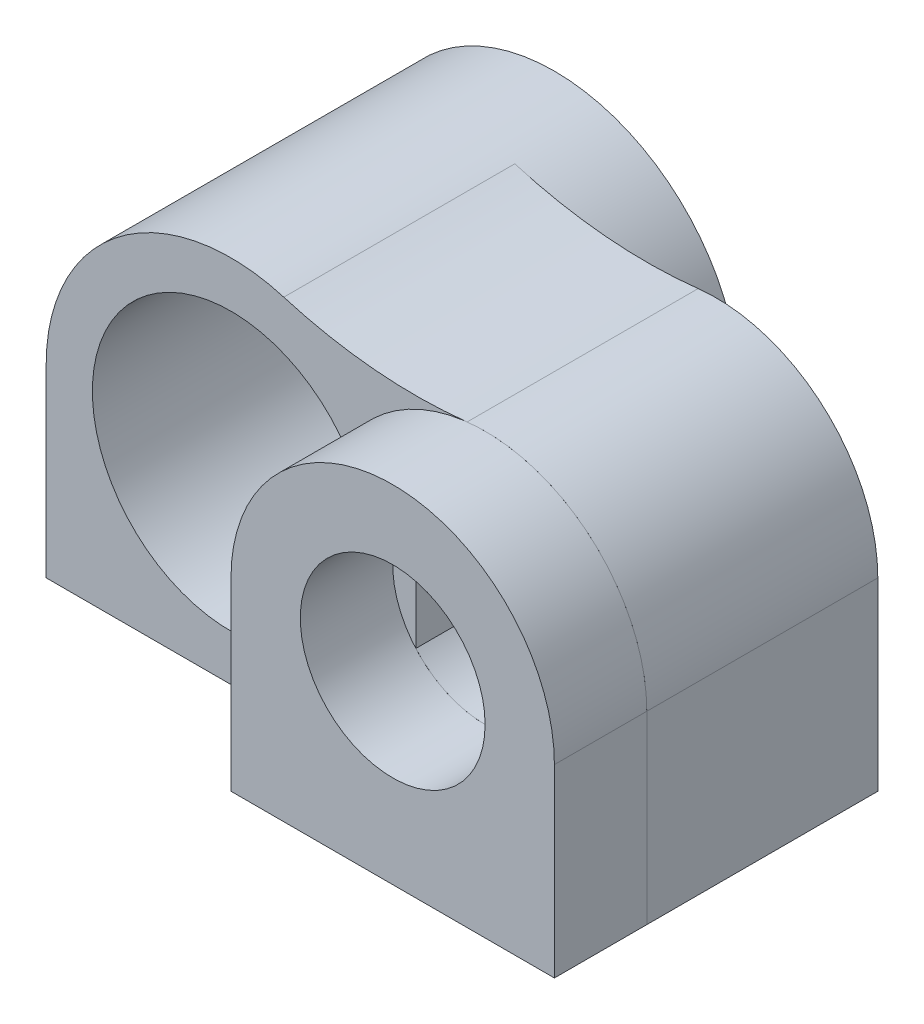
ISO-10303-21;
HEADER;
FILE_DESCRIPTION(('STEP AP214'),'2;1');
FILE_NAME('part.step','',(''),(''),'','','');
FILE_SCHEMA(('AUTOMOTIVE_DESIGN { 1 0 10303 214 1 1 1 1 }'));
ENDSEC;
DATA;
#1=APPLICATION_CONTEXT('core data for automotive mechanical design processes');
#2=APPLICATION_PROTOCOL_DEFINITION('international standard','automotive_design',2000,#1);
#3=PRODUCT_CONTEXT('',#1,'mechanical');
#4=PRODUCT('Part','Part','',(#3));
#5=PRODUCT_RELATED_PRODUCT_CATEGORY('part','',(#4));
#6=PRODUCT_DEFINITION_FORMATION('','',#4);
#7=PRODUCT_DEFINITION_CONTEXT('part definition',#1,'design');
#8=PRODUCT_DEFINITION('design','',#6,#7);
#9=PRODUCT_DEFINITION_SHAPE('','',#8);
#10=(LENGTH_UNIT() NAMED_UNIT(*) SI_UNIT(.MILLI.,.METRE.));
#11=(NAMED_UNIT(*) PLANE_ANGLE_UNIT() SI_UNIT($,.RADIAN.));
#12=(NAMED_UNIT(*) SI_UNIT($,.STERADIAN.) SOLID_ANGLE_UNIT());
#13=UNCERTAINTY_MEASURE_WITH_UNIT(LENGTH_MEASURE(1.E-05),#10,'distance_accuracy_value','');
#14=(GEOMETRIC_REPRESENTATION_CONTEXT(3) GLOBAL_UNCERTAINTY_ASSIGNED_CONTEXT((#13)) GLOBAL_UNIT_ASSIGNED_CONTEXT((#10,
#11,#12)) REPRESENTATION_CONTEXT('',''));
#15=CARTESIAN_POINT('',(0.,0.,0.));
#16=DIRECTION('',(0.,0.,1.));
#17=DIRECTION('',(1.,0.,0.));
#18=AXIS2_PLACEMENT_3D('',#15,#16,#17);
#19=CARTESIAN_POINT('',(5.5,0.,9.));
#20=DIRECTION('',(0.,0.,-1.));
#21=DIRECTION('',(-1.,0.,0.));
#22=AXIS2_PLACEMENT_3D('',#19,#20,#21);
#23=CYLINDRICAL_SURFACE('',#22,3.5);
#24=CARTESIAN_POINT('',(5.5,0.,7.));
#25=DIRECTION('',(0.,0.,1.));
#26=DIRECTION('',(1.,0.,0.));
#27=AXIS2_PLACEMENT_3D('',#24,#25,#26);
#28=CIRCLE('',#27,3.5);
#29=CARTESIAN_POINT('',(9.,0.,7.));
#30=VERTEX_POINT('',#29);
#31=CARTESIAN_POINT('',(2.,0.,7.));
#32=VERTEX_POINT('',#31);
#33=EDGE_CURVE('E116',#30,#32,#28,.T.);
#34=ORIENTED_EDGE('',*,*,#33,.T.);
#35=DIRECTION('',(0.,0.,-1.));
#36=VECTOR('',#35,1.);
#37=CARTESIAN_POINT('',(2.,0.,9.));
#38=LINE('',#37,#36);
#39=CARTESIAN_POINT('',(2.,0.,9.));
#40=VERTEX_POINT('',#39);
#41=EDGE_CURVE('E12',#40,#32,#38,.T.);
#42=ORIENTED_EDGE('',*,*,#41,.F.);
#43=CARTESIAN_POINT('',(5.5,0.,9.));
#44=DIRECTION('',(0.,0.,1.));
#45=DIRECTION('',(1.,0.,0.));
#46=AXIS2_PLACEMENT_3D('',#43,#44,#45);
#47=CIRCLE('',#46,3.5);
#48=CARTESIAN_POINT('',(9.,0.,9.));
#49=VERTEX_POINT('',#48);
#50=EDGE_CURVE('E101',#49,#40,#47,.T.);
#51=ORIENTED_EDGE('',*,*,#50,.F.);
#52=DIRECTION('',(0.,0.,-1.));
#53=VECTOR('',#52,1.);
#54=CARTESIAN_POINT('',(9.,0.,9.));
#55=LINE('',#54,#53);
#56=EDGE_CURVE('E115',#49,#30,#55,.T.);
#57=ORIENTED_EDGE('',*,*,#56,.T.);
#58=EDGE_LOOP('',(#34,#42,#51,#57));
#59=FACE_BOUND('',#58,.T.);
#60=ADVANCED_FACE('F49',(#59),#23,.T.);
#61=CARTESIAN_POINT('',(2.,0.,9.));
#62=DIRECTION('',(1.,0.,0.));
#63=DIRECTION('',(0.,1.,0.));
#64=AXIS2_PLACEMENT_3D('',#61,#62,#63);
#65=PLANE('',#64);
#66=DIRECTION('',(0.,-1.,0.));
#67=VECTOR('',#66,1.);
#68=CARTESIAN_POINT('',(2.,0.,7.));
#69=LINE('',#68,#67);
#70=CARTESIAN_POINT('',(2.,-4.,7.));
#71=VERTEX_POINT('',#70);
#72=EDGE_CURVE('E105',#32,#71,#69,.T.);
#73=ORIENTED_EDGE('',*,*,#72,.T.);
#74=DIRECTION('',(0.,0.,-1.));
#75=VECTOR('',#74,1.);
#76=CARTESIAN_POINT('',(2.,-4.,9.));
#77=LINE('',#76,#75);
#78=CARTESIAN_POINT('',(2.,-4.,9.));
#79=VERTEX_POINT('',#78);
#80=EDGE_CURVE('E57',#79,#71,#77,.T.);
#81=ORIENTED_EDGE('',*,*,#80,.F.);
#82=DIRECTION('',(0.,-1.,0.));
#83=VECTOR('',#82,1.);
#84=CARTESIAN_POINT('',(2.,0.,9.));
#85=LINE('',#84,#83);
#86=EDGE_CURVE('E95',#40,#79,#85,.T.);
#87=ORIENTED_EDGE('',*,*,#86,.F.);
#88=ORIENTED_EDGE('',*,*,#41,.T.);
#89=EDGE_LOOP('',(#73,#81,#87,#88));
#90=FACE_BOUND('',#89,.T.);
#91=ADVANCED_FACE('F104',(#90),#65,.F.);
#92=CARTESIAN_POINT('',(0.,-4.,9.));
#93=DIRECTION('',(0.,1.,0.));
#94=DIRECTION('',(0.,0.,1.));
#95=AXIS2_PLACEMENT_3D('',#92,#93,#94);
#96=PLANE('',#95);
#97=DIRECTION('',(1.,0.,0.));
#98=VECTOR('',#97,1.);
#99=CARTESIAN_POINT('',(0.,-4.,7.));
#100=LINE('',#99,#98);
#101=CARTESIAN_POINT('',(9.,-4.,7.));
#102=VERTEX_POINT('',#101);
#103=EDGE_CURVE('E82',#71,#102,#100,.T.);
#104=ORIENTED_EDGE('',*,*,#103,.T.);
#105=DIRECTION('',(0.,0.,-1.));
#106=VECTOR('',#105,1.);
#107=CARTESIAN_POINT('',(9.,-4.,9.));
#108=LINE('',#107,#106);
#109=CARTESIAN_POINT('',(9.,-4.,9.));
#110=VERTEX_POINT('',#109);
#111=EDGE_CURVE('E106',#110,#102,#108,.T.);
#112=ORIENTED_EDGE('',*,*,#111,.F.);
#113=DIRECTION('',(1.,0.,0.));
#114=VECTOR('',#113,1.);
#115=CARTESIAN_POINT('',(0.,-4.,9.));
#116=LINE('',#115,#114);
#117=EDGE_CURVE('E99',#79,#110,#116,.T.);
#118=ORIENTED_EDGE('',*,*,#117,.F.);
#119=ORIENTED_EDGE('',*,*,#80,.T.);
#120=EDGE_LOOP('',(#104,#112,#118,#119));
#121=FACE_BOUND('',#120,.T.);
#122=ADVANCED_FACE('F107',(#121),#96,.F.);
#123=CARTESIAN_POINT('',(9.,0.,9.));
#124=DIRECTION('',(-1.,0.,0.));
#125=DIRECTION('',(0.,0.,1.));
#126=AXIS2_PLACEMENT_3D('',#123,#124,#125);
#127=PLANE('',#126);
#128=DIRECTION('',(0.,1.,0.));
#129=VECTOR('',#128,1.);
#130=CARTESIAN_POINT('',(9.,0.,7.));
#131=LINE('',#130,#129);
#132=EDGE_CURVE('E88',#102,#30,#131,.T.);
#133=ORIENTED_EDGE('',*,*,#132,.T.);
#134=ORIENTED_EDGE('',*,*,#56,.F.);
#135=DIRECTION('',(0.,1.,0.));
#136=VECTOR('',#135,1.);
#137=CARTESIAN_POINT('',(9.,0.,9.));
#138=LINE('',#137,#136);
#139=EDGE_CURVE('E65',#110,#49,#138,.T.);
#140=ORIENTED_EDGE('',*,*,#139,.F.);
#141=ORIENTED_EDGE('',*,*,#111,.T.);
#142=EDGE_LOOP('',(#133,#134,#140,#141));
#143=FACE_BOUND('',#142,.T.);
#144=ADVANCED_FACE('F126',(#143),#127,.F.);
#145=CARTESIAN_POINT('',(5.5,0.,9.));
#146=DIRECTION('',(0.,0.,-1.));
#147=DIRECTION('',(-1.,0.,0.));
#148=AXIS2_PLACEMENT_3D('',#145,#146,#147);
#149=CYLINDRICAL_SURFACE('',#148,2.);
#150=CARTESIAN_POINT('',(5.5,0.,9.));
#151=DIRECTION('',(0.,0.,1.));
#152=DIRECTION('',(1.,0.,0.));
#153=AXIS2_PLACEMENT_3D('',#150,#151,#152);
#154=CIRCLE('',#153,2.);
#155=CARTESIAN_POINT('',(7.5,0.,9.));
#156=VERTEX_POINT('',#155);
#157=EDGE_CURVE('E109',#156,#156,#154,.T.);
#158=ORIENTED_EDGE('',*,*,#157,.T.);
#159=EDGE_LOOP('',(#158));
#160=FACE_BOUND('',#159,.T.);
#161=CARTESIAN_POINT('',(5.5,0.,7.));
#162=DIRECTION('',(0.,0.,1.));
#163=DIRECTION('',(1.,0.,0.));
#164=AXIS2_PLACEMENT_3D('',#161,#162,#163);
#165=CIRCLE('',#164,2.);
#166=CARTESIAN_POINT('',(7.5,0.,7.));
#167=VERTEX_POINT('',#166);
#168=EDGE_CURVE('E122',#167,#167,#165,.T.);
#169=ORIENTED_EDGE('',*,*,#168,.F.);
#170=EDGE_LOOP('',(#169));
#171=FACE_BOUND('',#170,.T.);
#172=ADVANCED_FACE('F143',(#160,#171),#149,.F.);
#173=CARTESIAN_POINT('',(0.,0.,9.));
#174=DIRECTION('',(0.,0.,1.));
#175=DIRECTION('',(1.,0.,0.));
#176=AXIS2_PLACEMENT_3D('',#173,#174,#175);
#177=PLANE('',#176);
#178=ORIENTED_EDGE('',*,*,#50,.T.);
#179=ORIENTED_EDGE('',*,*,#86,.T.);
#180=ORIENTED_EDGE('',*,*,#117,.T.);
#181=ORIENTED_EDGE('',*,*,#139,.T.);
#182=EDGE_LOOP('',(#178,#179,#180,#181));
#183=FACE_BOUND('',#182,.T.);
#184=ORIENTED_EDGE('',*,*,#157,.F.);
#185=EDGE_LOOP('',(#184));
#186=FACE_BOUND('',#185,.T.);
#187=ADVANCED_FACE('F96',(#183,#186),#177,.T.);
#188=CARTESIAN_POINT('',(0.,0.,7.));
#189=DIRECTION('',(0.,0.,1.));
#190=DIRECTION('',(1.,0.,0.));
#191=AXIS2_PLACEMENT_3D('',#188,#189,#190);
#192=PLANE('',#191);
#193=ORIENTED_EDGE('',*,*,#33,.F.);
#194=ORIENTED_EDGE('',*,*,#132,.F.);
#195=ORIENTED_EDGE('',*,*,#103,.F.);
#196=ORIENTED_EDGE('',*,*,#72,.F.);
#197=EDGE_LOOP('',(#193,#194,#195,#196));
#198=FACE_BOUND('',#197,.T.);
#199=ORIENTED_EDGE('',*,*,#168,.T.);
#200=EDGE_LOOP('',(#199));
#201=FACE_BOUND('',#200,.T.);
#202=ADVANCED_FACE('F129',(#198,#201),#192,.F.);
#203=CLOSED_SHELL('',(#60,#91,#122,#144,#172,#187,#202));
#204=MANIFOLD_SOLID_BREP('B2',#203);
#205=CARTESIAN_POINT('',(0.,0.,7.));
#206=DIRECTION('',(0.,0.,-1.));
#207=DIRECTION('',(-1.,0.,0.));
#208=AXIS2_PLACEMENT_3D('',#205,#206,#207);
#209=CYLINDRICAL_SURFACE('',#208,4.);
#210=CARTESIAN_POINT('',(0.,0.,7.));
#211=DIRECTION('',(0.,0.,1.));
#212=DIRECTION('',(1.,0.,0.));
#213=AXIS2_PLACEMENT_3D('',#210,#211,#212);
#214=CIRCLE('',#213,4.);
#215=CARTESIAN_POINT('',(1.14285714285714,3.83325938999964,7.));
#216=VERTEX_POINT('',#215);
#217=CARTESIAN_POINT('',(-4.,0.,7.));
#218=VERTEX_POINT('',#217);
#219=EDGE_CURVE('E343',#216,#218,#214,.T.);
#220=ORIENTED_EDGE('',*,*,#219,.F.);
#221=DIRECTION('',(0.,0.,-1.));
#222=VECTOR('',#221,1.);
#223=CARTESIAN_POINT('',(1.14285714285714,3.83325938999964,7.));
#224=LINE('',#223,#222);
#225=CARTESIAN_POINT('',(1.14285714285714,3.83325938999964,2.));
#226=VERTEX_POINT('',#225);
#227=EDGE_CURVE('E371',#216,#226,#224,.T.);
#228=ORIENTED_EDGE('',*,*,#227,.T.);
#229=CARTESIAN_POINT('',(0.,0.,2.));
#230=DIRECTION('',(0.,0.,1.));
#231=DIRECTION('',(1.,0.,0.));
#232=AXIS2_PLACEMENT_3D('',#229,#230,#231);
#233=CIRCLE('',#232,4.);
#234=CARTESIAN_POINT('',(3.84090909090909,1.11687839775506,2.));
#235=VERTEX_POINT('',#234);
#236=EDGE_CURVE('E229',#235,#226,#233,.T.);
#237=ORIENTED_EDGE('',*,*,#236,.F.);
#238=DIRECTION('',(0.,0.,1.));
#239=VECTOR('',#238,1.);
#240=CARTESIAN_POINT('',(3.84090909090909,1.11687839775506,2.));
#241=LINE('',#240,#239);
#242=CARTESIAN_POINT('',(3.84090909090909,1.11687839775506,7.));
#243=VERTEX_POINT('',#242);
#244=EDGE_CURVE('E301',#235,#243,#241,.T.);
#245=ORIENTED_EDGE('',*,*,#244,.T.);
#246=CARTESIAN_POINT('',(4.,0.,7.));
#247=VERTEX_POINT('',#246);
#248=EDGE_CURVE('E339',#247,#243,#214,.T.);
#249=ORIENTED_EDGE('',*,*,#248,.F.);
#250=DIRECTION('',(0.,0.,-1.));
#251=VECTOR('',#250,1.);
#252=CARTESIAN_POINT('',(4.,0.,7.));
#253=LINE('',#252,#251);
#254=CARTESIAN_POINT('',(4.,0.,0.));
#255=VERTEX_POINT('',#254);
#256=EDGE_CURVE('E349',#247,#255,#253,.T.);
#257=ORIENTED_EDGE('',*,*,#256,.T.);
#258=CARTESIAN_POINT('',(0.,0.,0.));
#259=DIRECTION('',(0.,0.,1.));
#260=DIRECTION('',(1.,0.,0.));
#261=AXIS2_PLACEMENT_3D('',#258,#259,#260);
#262=CIRCLE('',#261,4.);
#263=CARTESIAN_POINT('',(-4.,0.,0.));
#264=VERTEX_POINT('',#263);
#265=EDGE_CURVE('E336',#255,#264,#262,.T.);
#266=ORIENTED_EDGE('',*,*,#265,.T.);
#267=DIRECTION('',(0.,0.,-1.));
#268=VECTOR('',#267,1.);
#269=CARTESIAN_POINT('',(-4.,0.,7.));
#270=LINE('',#269,#268);
#271=EDGE_CURVE('E366',#218,#264,#270,.T.);
#272=ORIENTED_EDGE('',*,*,#271,.F.);
#273=EDGE_LOOP('',(#220,#228,#237,#245,#249,#257,#266,#272));
#274=FACE_BOUND('',#273,.T.);
#275=ADVANCED_FACE('F215',(#274),#209,.T.);
#276=CARTESIAN_POINT('',(4.,-4.,7.));
#277=DIRECTION('',(-1.,0.,0.));
#278=DIRECTION('',(0.,-1.,0.));
#279=AXIS2_PLACEMENT_3D('',#276,#277,#278);
#280=PLANE('',#279);
#281=DIRECTION('',(0.,0.,1.));
#282=VECTOR('',#281,1.);
#283=CARTESIAN_POINT('',(4.,-1.3228756555323,2.));
#284=LINE('',#283,#282);
#285=CARTESIAN_POINT('',(4.,-1.3228756555323,2.));
#286=VERTEX_POINT('',#285);
#287=CARTESIAN_POINT('',(4.,-1.3228756555323,7.));
#288=VERTEX_POINT('',#287);
#289=EDGE_CURVE('E328',#286,#288,#284,.T.);
#290=ORIENTED_EDGE('',*,*,#289,.F.);
#291=DIRECTION('',(0.,1.,0.));
#292=VECTOR('',#291,1.);
#293=CARTESIAN_POINT('',(4.,0.,2.));
#294=LINE('',#293,#292);
#295=CARTESIAN_POINT('',(4.,-4.,2.));
#296=VERTEX_POINT('',#295);
#297=EDGE_CURVE('E320',#296,#286,#294,.T.);
#298=ORIENTED_EDGE('',*,*,#297,.F.);
#299=DIRECTION('',(0.,0.,-1.));
#300=VECTOR('',#299,1.);
#301=CARTESIAN_POINT('',(4.,-4.,7.));
#302=LINE('',#301,#300);
#303=CARTESIAN_POINT('',(4.,-4.,0.));
#304=VERTEX_POINT('',#303);
#305=EDGE_CURVE('E361',#296,#304,#302,.T.);
#306=ORIENTED_EDGE('',*,*,#305,.T.);
#307=DIRECTION('',(0.,1.,0.));
#308=VECTOR('',#307,1.);
#309=CARTESIAN_POINT('',(4.,-4.,0.));
#310=LINE('',#309,#308);
#311=EDGE_CURVE('E357',#304,#255,#310,.T.);
#312=ORIENTED_EDGE('',*,*,#311,.T.);
#313=ORIENTED_EDGE('',*,*,#256,.F.);
#314=DIRECTION('',(0.,1.,0.));
#315=VECTOR('',#314,1.);
#316=CARTESIAN_POINT('',(4.,-4.,7.));
#317=LINE('',#316,#315);
#318=EDGE_CURVE('E347',#288,#247,#317,.T.);
#319=ORIENTED_EDGE('',*,*,#318,.F.);
#320=EDGE_LOOP('',(#290,#298,#306,#312,#313,#319));
#321=FACE_BOUND('',#320,.T.);
#322=ADVANCED_FACE('F388',(#321),#280,.F.);
#323=CARTESIAN_POINT('',(0.,0.,7.));
#324=DIRECTION('',(0.,0.,1.));
#325=DIRECTION('',(1.,0.,0.));
#326=AXIS2_PLACEMENT_3D('',#323,#324,#325);
#327=PLANE('',#326);
#328=CARTESIAN_POINT('',(5.5,0.,7.));
#329=DIRECTION('',(0.,0.,1.));
#330=DIRECTION('',(1.,0.,0.));
#331=AXIS2_PLACEMENT_3D('',#328,#329,#330);
#332=CIRCLE('',#331,3.5);
#333=CARTESIAN_POINT('',(9.,0.,7.));
#334=VERTEX_POINT('',#333);
#335=CARTESIAN_POINT('',(5.11111111111111,3.47832796499967,7.));
#336=VERTEX_POINT('',#335);
#337=EDGE_CURVE('E296',#334,#336,#332,.T.);
#338=ORIENTED_EDGE('',*,*,#337,.T.);
#339=CARTESIAN_POINT('',(4.,13.4164078649987,7.));
#340=DIRECTION('',(0.,0.,1.));
#341=DIRECTION('',(1.,0.,0.));
#342=AXIS2_PLACEMENT_3D('',#339,#340,#341);
#343=CIRCLE('',#342,10.);
#344=EDGE_CURVE('E223',#336,#216,#343,.F.);
#345=ORIENTED_EDGE('',*,*,#344,.T.);
#346=ORIENTED_EDGE('',*,*,#219,.T.);
#347=DIRECTION('',(0.,-1.,0.));
#348=VECTOR('',#347,1.);
#349=CARTESIAN_POINT('',(-4.,0.,7.));
#350=LINE('',#349,#348);
#351=CARTESIAN_POINT('',(-4.,-4.,7.));
#352=VERTEX_POINT('',#351);
#353=EDGE_CURVE('E342',#218,#352,#350,.T.);
#354=ORIENTED_EDGE('',*,*,#353,.T.);
#355=DIRECTION('',(1.,0.,0.));
#356=VECTOR('',#355,1.);
#357=CARTESIAN_POINT('',(-4.,-4.,7.));
#358=LINE('',#357,#356);
#359=CARTESIAN_POINT('',(9.,-4.,7.));
#360=VERTEX_POINT('',#359);
#361=EDGE_CURVE('E345',#352,#360,#358,.T.);
#362=ORIENTED_EDGE('',*,*,#361,.T.);
#363=DIRECTION('',(0.,1.,0.));
#364=VECTOR('',#363,1.);
#365=CARTESIAN_POINT('',(9.,0.,7.));
#366=LINE('',#365,#364);
#367=EDGE_CURVE('E323',#360,#334,#366,.T.);
#368=ORIENTED_EDGE('',*,*,#367,.T.);
#369=EDGE_LOOP('',(#338,#345,#346,#354,#362,#368));
#370=FACE_BOUND('',#369,.T.);
#371=ORIENTED_EDGE('',*,*,#248,.T.);
#372=CARTESIAN_POINT('',(5.5,0.,7.));
#373=DIRECTION('',(0.,0.,1.));
#374=DIRECTION('',(1.,0.,0.));
#375=AXIS2_PLACEMENT_3D('',#372,#373,#374);
#376=CIRCLE('',#375,2.);
#377=EDGE_CURVE('E313',#288,#243,#376,.T.);
#378=ORIENTED_EDGE('',*,*,#377,.F.);
#379=ORIENTED_EDGE('',*,*,#318,.T.);
#380=EDGE_LOOP('',(#371,#378,#379));
#381=FACE_BOUND('',#380,.T.);
#382=CARTESIAN_POINT('',(0.,0.,7.));
#383=DIRECTION('',(0.,0.,1.));
#384=DIRECTION('',(1.,0.,0.));
#385=AXIS2_PLACEMENT_3D('',#382,#383,#384);
#386=CIRCLE('',#385,3.);
#387=CARTESIAN_POINT('',(3.,0.,7.));
#388=VERTEX_POINT('',#387);
#389=EDGE_CURVE('E333',#388,#388,#386,.T.);
#390=ORIENTED_EDGE('',*,*,#389,.F.);
#391=EDGE_LOOP('',(#390));
#392=FACE_BOUND('',#391,.T.);
#393=ADVANCED_FACE('F376',(#370,#381,#392),#327,.T.);
#394=CARTESIAN_POINT('',(0.,0.,0.));
#395=DIRECTION('',(0.,0.,1.));
#396=DIRECTION('',(1.,0.,0.));
#397=AXIS2_PLACEMENT_3D('',#394,#395,#396);
#398=PLANE('',#397);
#399=ORIENTED_EDGE('',*,*,#265,.F.);
#400=ORIENTED_EDGE('',*,*,#311,.F.);
#401=DIRECTION('',(1.,0.,0.));
#402=VECTOR('',#401,1.);
#403=CARTESIAN_POINT('',(-4.,-4.,0.));
#404=LINE('',#403,#402);
#405=CARTESIAN_POINT('',(-4.,-4.,0.));
#406=VERTEX_POINT('',#405);
#407=EDGE_CURVE('E354',#406,#304,#404,.T.);
#408=ORIENTED_EDGE('',*,*,#407,.F.);
#409=DIRECTION('',(0.,-1.,0.));
#410=VECTOR('',#409,1.);
#411=CARTESIAN_POINT('',(-4.,0.,0.));
#412=LINE('',#411,#410);
#413=EDGE_CURVE('E352',#264,#406,#412,.T.);
#414=ORIENTED_EDGE('',*,*,#413,.F.);
#415=EDGE_LOOP('',(#399,#400,#408,#414));
#416=FACE_BOUND('',#415,.T.);
#417=CARTESIAN_POINT('',(0.,0.,0.));
#418=DIRECTION('',(0.,0.,1.));
#419=DIRECTION('',(1.,0.,0.));
#420=AXIS2_PLACEMENT_3D('',#417,#418,#419);
#421=CIRCLE('',#420,3.);
#422=CARTESIAN_POINT('',(3.,0.,0.));
#423=VERTEX_POINT('',#422);
#424=EDGE_CURVE('E327',#423,#423,#421,.T.);
#425=ORIENTED_EDGE('',*,*,#424,.T.);
#426=EDGE_LOOP('',(#425));
#427=FACE_BOUND('',#426,.T.);
#428=ADVANCED_FACE('F399',(#416,#427),#398,.F.);
#429=CARTESIAN_POINT('',(-4.,0.,7.));
#430=DIRECTION('',(1.,0.,0.));
#431=DIRECTION('',(0.,1.,0.));
#432=AXIS2_PLACEMENT_3D('',#429,#430,#431);
#433=PLANE('',#432);
#434=ORIENTED_EDGE('',*,*,#413,.T.);
#435=DIRECTION('',(0.,0.,-1.));
#436=VECTOR('',#435,1.);
#437=CARTESIAN_POINT('',(-4.,-4.,7.));
#438=LINE('',#437,#436);
#439=EDGE_CURVE('E363',#352,#406,#438,.T.);
#440=ORIENTED_EDGE('',*,*,#439,.F.);
#441=ORIENTED_EDGE('',*,*,#353,.F.);
#442=ORIENTED_EDGE('',*,*,#271,.T.);
#443=EDGE_LOOP('',(#434,#440,#441,#442));
#444=FACE_BOUND('',#443,.T.);
#445=ADVANCED_FACE('F403',(#444),#433,.F.);
#446=CARTESIAN_POINT('',(-4.,-4.,7.));
#447=DIRECTION('',(0.,1.,0.));
#448=DIRECTION('',(0.,0.,1.));
#449=AXIS2_PLACEMENT_3D('',#446,#447,#448);
#450=PLANE('',#449);
#451=ORIENTED_EDGE('',*,*,#407,.T.);
#452=ORIENTED_EDGE('',*,*,#305,.F.);
#453=DIRECTION('',(1.,0.,0.));
#454=VECTOR('',#453,1.);
#455=CARTESIAN_POINT('',(0.,-4.,2.));
#456=LINE('',#455,#454);
#457=CARTESIAN_POINT('',(9.,-4.,2.));
#458=VERTEX_POINT('',#457);
#459=EDGE_CURVE('E302',#296,#458,#456,.T.);
#460=ORIENTED_EDGE('',*,*,#459,.T.);
#461=DIRECTION('',(0.,0.,1.));
#462=VECTOR('',#461,1.);
#463=CARTESIAN_POINT('',(9.,-4.,2.));
#464=LINE('',#463,#462);
#465=EDGE_CURVE('E312',#458,#360,#464,.T.);
#466=ORIENTED_EDGE('',*,*,#465,.T.);
#467=ORIENTED_EDGE('',*,*,#361,.F.);
#468=ORIENTED_EDGE('',*,*,#439,.T.);
#469=EDGE_LOOP('',(#451,#452,#460,#466,#467,#468));
#470=FACE_BOUND('',#469,.T.);
#471=ADVANCED_FACE('F382',(#470),#450,.F.);
#472=CARTESIAN_POINT('',(0.,0.,7.));
#473=DIRECTION('',(0.,0.,-1.));
#474=DIRECTION('',(-1.,0.,0.));
#475=AXIS2_PLACEMENT_3D('',#472,#473,#474);
#476=CYLINDRICAL_SURFACE('',#475,3.);
#477=ORIENTED_EDGE('',*,*,#389,.T.);
#478=EDGE_LOOP('',(#477));
#479=FACE_BOUND('',#478,.T.);
#480=ORIENTED_EDGE('',*,*,#424,.F.);
#481=EDGE_LOOP('',(#480));
#482=FACE_BOUND('',#481,.T.);
#483=ADVANCED_FACE('F410',(#479,#482),#476,.F.);
#484=CARTESIAN_POINT('',(9.,0.,2.));
#485=DIRECTION('',(1.,0.,0.));
#486=DIRECTION('',(0.,0.,-1.));
#487=AXIS2_PLACEMENT_3D('',#484,#485,#486);
#488=PLANE('',#487);
#489=ORIENTED_EDGE('',*,*,#367,.F.);
#490=ORIENTED_EDGE('',*,*,#465,.F.);
#491=DIRECTION('',(0.,1.,0.));
#492=VECTOR('',#491,1.);
#493=CARTESIAN_POINT('',(9.,0.,2.));
#494=LINE('',#493,#492);
#495=CARTESIAN_POINT('',(9.,0.,2.));
#496=VERTEX_POINT('',#495);
#497=EDGE_CURVE('E306',#458,#496,#494,.T.);
#498=ORIENTED_EDGE('',*,*,#497,.T.);
#499=DIRECTION('',(0.,0.,1.));
#500=VECTOR('',#499,1.);
#501=CARTESIAN_POINT('',(9.,0.,2.));
#502=LINE('',#501,#500);
#503=EDGE_CURVE('E290',#496,#334,#502,.T.);
#504=ORIENTED_EDGE('',*,*,#503,.T.);
#505=EDGE_LOOP('',(#489,#490,#498,#504));
#506=FACE_BOUND('',#505,.T.);
#507=ADVANCED_FACE('F310',(#506),#488,.T.);
#508=CARTESIAN_POINT('',(5.5,0.,2.));
#509=DIRECTION('',(0.,0.,1.));
#510=DIRECTION('',(1.,0.,0.));
#511=AXIS2_PLACEMENT_3D('',#508,#509,#510);
#512=CYLINDRICAL_SURFACE('',#511,2.);
#513=ORIENTED_EDGE('',*,*,#377,.T.);
#514=ORIENTED_EDGE('',*,*,#244,.F.);
#515=CARTESIAN_POINT('',(5.5,0.,2.));
#516=DIRECTION('',(0.,0.,1.));
#517=DIRECTION('',(1.,0.,0.));
#518=AXIS2_PLACEMENT_3D('',#515,#516,#517);
#519=CIRCLE('',#518,2.);
#520=EDGE_CURVE('E318',#286,#235,#519,.T.);
#521=ORIENTED_EDGE('',*,*,#520,.F.);
#522=ORIENTED_EDGE('',*,*,#289,.T.);
#523=EDGE_LOOP('',(#513,#514,#521,#522));
#524=FACE_BOUND('',#523,.T.);
#525=ADVANCED_FACE('F392',(#524),#512,.F.);
#526=CARTESIAN_POINT('',(5.5,0.,2.));
#527=DIRECTION('',(0.,0.,1.));
#528=DIRECTION('',(1.,0.,0.));
#529=AXIS2_PLACEMENT_3D('',#526,#527,#528);
#530=CYLINDRICAL_SURFACE('',#529,3.5);
#531=CARTESIAN_POINT('',(5.5,0.,2.));
#532=DIRECTION('',(0.,0.,1.));
#533=DIRECTION('',(1.,0.,0.));
#534=AXIS2_PLACEMENT_3D('',#531,#532,#533);
#535=CIRCLE('',#534,3.5);
#536=CARTESIAN_POINT('',(5.11111111111111,3.47832796499967,2.));
#537=VERTEX_POINT('',#536);
#538=EDGE_CURVE('E294',#496,#537,#535,.T.);
#539=ORIENTED_EDGE('',*,*,#538,.T.);
#540=DIRECTION('',(0.,0.,1.));
#541=VECTOR('',#540,1.);
#542=CARTESIAN_POINT('',(5.11111111111111,3.47832796499967,2.));
#543=LINE('',#542,#541);
#544=EDGE_CURVE('E369',#537,#336,#543,.T.);
#545=ORIENTED_EDGE('',*,*,#544,.T.);
#546=ORIENTED_EDGE('',*,*,#337,.F.);
#547=ORIENTED_EDGE('',*,*,#503,.F.);
#548=EDGE_LOOP('',(#539,#545,#546,#547));
#549=FACE_BOUND('',#548,.T.);
#550=ADVANCED_FACE('F292',(#549),#530,.T.);
#551=CARTESIAN_POINT('',(0.,0.,2.));
#552=DIRECTION('',(0.,0.,1.));
#553=DIRECTION('',(1.,0.,0.));
#554=AXIS2_PLACEMENT_3D('',#551,#552,#553);
#555=PLANE('',#554);
#556=ORIENTED_EDGE('',*,*,#497,.F.);
#557=ORIENTED_EDGE('',*,*,#459,.F.);
#558=ORIENTED_EDGE('',*,*,#297,.T.);
#559=ORIENTED_EDGE('',*,*,#520,.T.);
#560=ORIENTED_EDGE('',*,*,#236,.T.);
#561=CARTESIAN_POINT('',(4.,13.4164078649987,2.));
#562=DIRECTION('',(0.,0.,1.));
#563=DIRECTION('',(1.,0.,0.));
#564=AXIS2_PLACEMENT_3D('',#561,#562,#563);
#565=CIRCLE('',#564,10.);
#566=EDGE_CURVE('E47',#226,#537,#565,.T.);
#567=ORIENTED_EDGE('',*,*,#566,.T.);
#568=ORIENTED_EDGE('',*,*,#538,.F.);
#569=EDGE_LOOP('',(#556,#557,#558,#559,#560,#567,#568));
#570=FACE_BOUND('',#569,.T.);
#571=ADVANCED_FACE('F305',(#570),#555,.F.);
#572=CARTESIAN_POINT('',(4.,13.4164078649987,7.));
#573=DIRECTION('',(0.,0.,-1.));
#574=DIRECTION('',(-1.,0.,0.));
#575=AXIS2_PLACEMENT_3D('',#572,#573,#574);
#576=CYLINDRICAL_SURFACE('',#575,10.);
#577=ORIENTED_EDGE('',*,*,#566,.F.);
#578=ORIENTED_EDGE('',*,*,#227,.F.);
#579=ORIENTED_EDGE('',*,*,#344,.F.);
#580=ORIENTED_EDGE('',*,*,#544,.F.);
#581=EDGE_LOOP('',(#577,#578,#579,#580));
#582=FACE_BOUND('',#581,.T.);
#583=ADVANCED_FACE('F217',(#582),#576,.F.);
#584=CLOSED_SHELL('',(#275,#322,#393,#428,#445,#471,#483,#507,#525,#550,#571,#583));
#585=MANIFOLD_SOLID_BREP('B6',#584);
#586=ADVANCED_BREP_SHAPE_REPRESENTATION('',(#18,#204,#585),#14);
#587=SHAPE_DEFINITION_REPRESENTATION(#9,#586);
ENDSEC;
END-ISO-10303-21;
